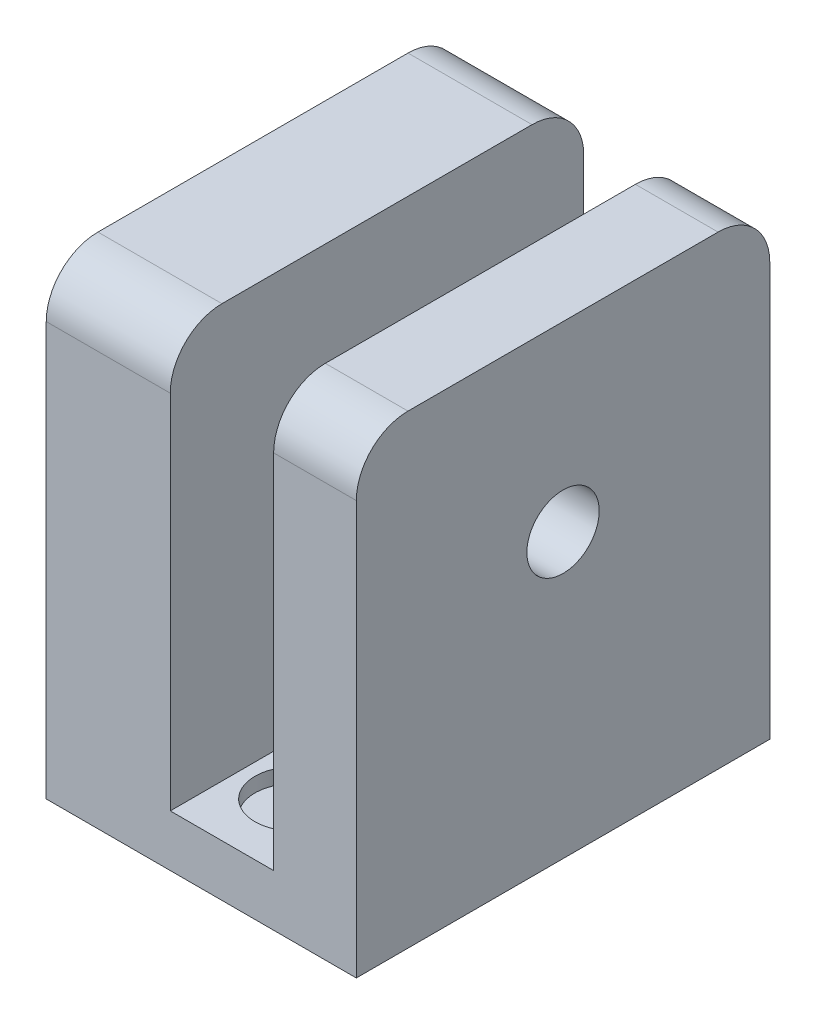
ISO-10303-21;
HEADER;
FILE_DESCRIPTION(('STEP AP214'),'2;1');
FILE_NAME('part.step','',(''),(''),'','','');
FILE_SCHEMA(('AUTOMOTIVE_DESIGN { 1 0 10303 214 1 1 1 1 }'));
ENDSEC;
DATA;
#1=APPLICATION_CONTEXT('core data for automotive mechanical design processes');
#2=APPLICATION_PROTOCOL_DEFINITION('international standard','automotive_design',2000,#1);
#3=PRODUCT_CONTEXT('',#1,'mechanical');
#4=PRODUCT('Part','Part','',(#3));
#5=PRODUCT_RELATED_PRODUCT_CATEGORY('part','',(#4));
#6=PRODUCT_DEFINITION_FORMATION('','',#4);
#7=PRODUCT_DEFINITION_CONTEXT('part definition',#1,'design');
#8=PRODUCT_DEFINITION('design','',#6,#7);
#9=PRODUCT_DEFINITION_SHAPE('','',#8);
#10=(LENGTH_UNIT() NAMED_UNIT(*) SI_UNIT(.MILLI.,.METRE.));
#11=(NAMED_UNIT(*) PLANE_ANGLE_UNIT() SI_UNIT($,.RADIAN.));
#12=(NAMED_UNIT(*) SI_UNIT($,.STERADIAN.) SOLID_ANGLE_UNIT());
#13=UNCERTAINTY_MEASURE_WITH_UNIT(LENGTH_MEASURE(1.E-05),#10,'distance_accuracy_value','');
#14=(GEOMETRIC_REPRESENTATION_CONTEXT(3) GLOBAL_UNCERTAINTY_ASSIGNED_CONTEXT((#13)) GLOBAL_UNIT_ASSIGNED_CONTEXT((#10,
#11,#12)) REPRESENTATION_CONTEXT('',''));
#15=CARTESIAN_POINT('',(0.,0.,0.));
#16=DIRECTION('',(0.,0.,1.));
#17=DIRECTION('',(1.,0.,0.));
#18=AXIS2_PLACEMENT_3D('',#15,#16,#17);
#19=CARTESIAN_POINT('',(-15.,45.,20.));
#20=DIRECTION('',(0.,0.,-1.));
#21=DIRECTION('',(-1.,0.,0.));
#22=AXIS2_PLACEMENT_3D('',#19,#20,#21);
#23=PLANE('',#22);
#24=DIRECTION('',(-1.,0.,0.));
#25=VECTOR('',#24,1.);
#26=CARTESIAN_POINT('',(15.,40.,20.));
#27=LINE('',#26,#25);
#28=CARTESIAN_POINT('',(-3.,40.,20.));
#29=VERTEX_POINT('',#28);
#30=CARTESIAN_POINT('',(-15.,40.,20.));
#31=VERTEX_POINT('',#30);
#32=EDGE_CURVE('E48',#29,#31,#27,.T.);
#33=ORIENTED_EDGE('',*,*,#32,.T.);
#34=DIRECTION('',(0.,-1.,0.));
#35=VECTOR('',#34,1.);
#36=CARTESIAN_POINT('',(-15.,45.,20.));
#37=LINE('',#36,#35);
#38=CARTESIAN_POINT('',(-15.,0.,20.));
#39=VERTEX_POINT('',#38);
#40=EDGE_CURVE('E141',#31,#39,#37,.T.);
#41=ORIENTED_EDGE('',*,*,#40,.T.);
#42=DIRECTION('',(1.,0.,0.));
#43=VECTOR('',#42,1.);
#44=CARTESIAN_POINT('',(-15.,0.,20.));
#45=LINE('',#44,#43);
#46=CARTESIAN_POINT('',(15.,0.,20.));
#47=VERTEX_POINT('',#46);
#48=EDGE_CURVE('E139',#39,#47,#45,.T.);
#49=ORIENTED_EDGE('',*,*,#48,.T.);
#50=DIRECTION('',(0.,-1.,0.));
#51=VECTOR('',#50,1.);
#52=CARTESIAN_POINT('',(15.,45.,20.));
#53=LINE('',#52,#51);
#54=CARTESIAN_POINT('',(15.,40.,20.));
#55=VERTEX_POINT('',#54);
#56=EDGE_CURVE('E132',#55,#47,#53,.T.);
#57=ORIENTED_EDGE('',*,*,#56,.F.);
#58=CARTESIAN_POINT('',(7.,40.,20.));
#59=VERTEX_POINT('',#58);
#60=EDGE_CURVE('E119',#55,#59,#27,.T.);
#61=ORIENTED_EDGE('',*,*,#60,.T.);
#62=DIRECTION('',(0.,1.,0.));
#63=VECTOR('',#62,1.);
#64=CARTESIAN_POINT('',(7.,45.,20.));
#65=LINE('',#64,#63);
#66=CARTESIAN_POINT('',(7.,5.,20.));
#67=VERTEX_POINT('',#66);
#68=EDGE_CURVE('E193',#67,#59,#65,.T.);
#69=ORIENTED_EDGE('',*,*,#68,.F.);
#70=DIRECTION('',(1.,0.,0.));
#71=VECTOR('',#70,1.);
#72=CARTESIAN_POINT('',(-3.,5.,20.));
#73=LINE('',#72,#71);
#74=CARTESIAN_POINT('',(-3.,5.,20.));
#75=VERTEX_POINT('',#74);
#76=EDGE_CURVE('E190',#75,#67,#73,.T.);
#77=ORIENTED_EDGE('',*,*,#76,.F.);
#78=DIRECTION('',(0.,-1.,0.));
#79=VECTOR('',#78,1.);
#80=CARTESIAN_POINT('',(-3.,45.,20.));
#81=LINE('',#80,#79);
#82=EDGE_CURVE('E188',#29,#75,#81,.T.);
#83=ORIENTED_EDGE('',*,*,#82,.F.);
#84=EDGE_LOOP('',(#33,#41,#49,#57,#61,#69,#77,#83));
#85=FACE_BOUND('',#84,.T.);
#86=ADVANCED_FACE('F33',(#85),#23,.F.);
#87=CARTESIAN_POINT('',(0.,45.,0.));
#88=DIRECTION('',(0.,-1.,0.));
#89=DIRECTION('',(0.,0.,-1.));
#90=AXIS2_PLACEMENT_3D('',#87,#88,#89);
#91=PLANE('',#90);
#92=DIRECTION('',(0.,0.,1.));
#93=VECTOR('',#92,1.);
#94=CARTESIAN_POINT('',(-15.,45.,20.));
#95=LINE('',#94,#93);
#96=CARTESIAN_POINT('',(-15.,45.,-15.));
#97=VERTEX_POINT('',#96);
#98=CARTESIAN_POINT('',(-15.,45.,15.));
#99=VERTEX_POINT('',#98);
#100=EDGE_CURVE('E142',#97,#99,#95,.T.);
#101=ORIENTED_EDGE('',*,*,#100,.T.);
#102=DIRECTION('',(-1.,0.,0.));
#103=VECTOR('',#102,1.);
#104=CARTESIAN_POINT('',(15.,45.,15.));
#105=LINE('',#104,#103);
#106=CARTESIAN_POINT('',(-3.,45.,15.));
#107=VERTEX_POINT('',#106);
#108=EDGE_CURVE('E127',#107,#99,#105,.T.);
#109=ORIENTED_EDGE('',*,*,#108,.F.);
#110=DIRECTION('',(0.,0.,1.));
#111=VECTOR('',#110,1.);
#112=CARTESIAN_POINT('',(-3.,45.,-20.));
#113=LINE('',#112,#111);
#114=CARTESIAN_POINT('',(-3.,45.,-15.));
#115=VERTEX_POINT('',#114);
#116=EDGE_CURVE('E195',#115,#107,#113,.T.);
#117=ORIENTED_EDGE('',*,*,#116,.F.);
#118=DIRECTION('',(-1.,0.,0.));
#119=VECTOR('',#118,1.);
#120=CARTESIAN_POINT('',(15.,45.,-15.));
#121=LINE('',#120,#119);
#122=EDGE_CURVE('E238',#115,#97,#121,.T.);
#123=ORIENTED_EDGE('',*,*,#122,.T.);
#124=EDGE_LOOP('',(#101,#109,#117,#123));
#125=FACE_BOUND('',#124,.T.);
#126=ADVANCED_FACE('F298',(#125),#91,.F.);
#127=DIRECTION('',(0.,0.,1.));
#128=VECTOR('',#127,1.);
#129=CARTESIAN_POINT('',(7.,45.,-20.));
#130=LINE('',#129,#128);
#131=CARTESIAN_POINT('',(7.,45.,-15.));
#132=VERTEX_POINT('',#131);
#133=CARTESIAN_POINT('',(7.,45.,15.));
#134=VERTEX_POINT('',#133);
#135=EDGE_CURVE('E167',#132,#134,#130,.T.);
#136=ORIENTED_EDGE('',*,*,#135,.T.);
#137=CARTESIAN_POINT('',(15.,45.,15.));
#138=VERTEX_POINT('',#137);
#139=EDGE_CURVE('E56',#138,#134,#105,.T.);
#140=ORIENTED_EDGE('',*,*,#139,.F.);
#141=DIRECTION('',(0.,0.,-1.));
#142=VECTOR('',#141,1.);
#143=CARTESIAN_POINT('',(15.,45.,20.));
#144=LINE('',#143,#142);
#145=CARTESIAN_POINT('',(15.,45.,-15.));
#146=VERTEX_POINT('',#145);
#147=EDGE_CURVE('E135',#138,#146,#144,.T.);
#148=ORIENTED_EDGE('',*,*,#147,.T.);
#149=EDGE_CURVE('E222',#146,#132,#121,.T.);
#150=ORIENTED_EDGE('',*,*,#149,.T.);
#151=EDGE_LOOP('',(#136,#140,#148,#150));
#152=FACE_BOUND('',#151,.T.);
#153=ADVANCED_FACE('F284',(#152),#91,.F.);
#154=CARTESIAN_POINT('',(15.,45.,20.));
#155=DIRECTION('',(-1.,0.,0.));
#156=DIRECTION('',(0.,0.,1.));
#157=AXIS2_PLACEMENT_3D('',#154,#155,#156);
#158=PLANE('',#157);
#159=CARTESIAN_POINT('',(15.,27.3918539452893,0.));
#160=DIRECTION('',(-1.,0.,0.));
#161=DIRECTION('',(0.,0.,1.));
#162=AXIS2_PLACEMENT_3D('',#159,#160,#161);
#163=CIRCLE('',#162,3.5);
#164=CARTESIAN_POINT('',(15.,27.3918539452893,3.5));
#165=VERTEX_POINT('',#164);
#166=EDGE_CURVE('E157',#165,#165,#163,.T.);
#167=ORIENTED_EDGE('',*,*,#166,.T.);
#168=EDGE_LOOP('',(#167));
#169=FACE_BOUND('',#168,.T.);
#170=ORIENTED_EDGE('',*,*,#147,.F.);
#171=CARTESIAN_POINT('',(15.,40.,15.));
#172=DIRECTION('',(1.,0.,0.));
#173=DIRECTION('',(0.,0.,-1.));
#174=AXIS2_PLACEMENT_3D('',#171,#172,#173);
#175=CIRCLE('',#174,5.);
#176=EDGE_CURVE('E122',#138,#55,#175,.T.);
#177=ORIENTED_EDGE('',*,*,#176,.T.);
#178=ORIENTED_EDGE('',*,*,#56,.T.);
#179=DIRECTION('',(0.,0.,-1.));
#180=VECTOR('',#179,1.);
#181=CARTESIAN_POINT('',(15.,0.,20.));
#182=LINE('',#181,#180);
#183=CARTESIAN_POINT('',(15.,0.,-20.));
#184=VERTEX_POINT('',#183);
#185=EDGE_CURVE('E198',#47,#184,#182,.T.);
#186=ORIENTED_EDGE('',*,*,#185,.T.);
#187=DIRECTION('',(0.,-1.,0.));
#188=VECTOR('',#187,1.);
#189=CARTESIAN_POINT('',(15.,45.,-20.));
#190=LINE('',#189,#188);
#191=CARTESIAN_POINT('',(15.,40.,-20.));
#192=VERTEX_POINT('',#191);
#193=EDGE_CURVE('E152',#192,#184,#190,.T.);
#194=ORIENTED_EDGE('',*,*,#193,.F.);
#195=CARTESIAN_POINT('',(15.,40.,-15.));
#196=DIRECTION('',(1.,0.,0.));
#197=DIRECTION('',(0.,0.,-1.));
#198=AXIS2_PLACEMENT_3D('',#195,#196,#197);
#199=CIRCLE('',#198,5.);
#200=EDGE_CURVE('E216',#192,#146,#199,.T.);
#201=ORIENTED_EDGE('',*,*,#200,.T.);
#202=EDGE_LOOP('',(#170,#177,#178,#186,#194,#201));
#203=FACE_BOUND('',#202,.T.);
#204=ADVANCED_FACE('F35',(#169,#203),#158,.F.);
#205=CARTESIAN_POINT('',(-15.,45.,-20.));
#206=DIRECTION('',(0.,0.,1.));
#207=DIRECTION('',(1.,0.,0.));
#208=AXIS2_PLACEMENT_3D('',#205,#206,#207);
#209=PLANE('',#208);
#210=DIRECTION('',(0.,-1.,0.));
#211=VECTOR('',#210,1.);
#212=CARTESIAN_POINT('',(-15.,45.,-20.));
#213=LINE('',#212,#211);
#214=CARTESIAN_POINT('',(-15.,40.,-20.));
#215=VERTEX_POINT('',#214);
#216=CARTESIAN_POINT('',(-15.,0.,-20.));
#217=VERTEX_POINT('',#216);
#218=EDGE_CURVE('E144',#215,#217,#213,.T.);
#219=ORIENTED_EDGE('',*,*,#218,.F.);
#220=DIRECTION('',(-1.,0.,0.));
#221=VECTOR('',#220,1.);
#222=CARTESIAN_POINT('',(15.,40.,-20.));
#223=LINE('',#222,#221);
#224=CARTESIAN_POINT('',(-3.,40.,-20.));
#225=VERTEX_POINT('',#224);
#226=EDGE_CURVE('E218',#225,#215,#223,.T.);
#227=ORIENTED_EDGE('',*,*,#226,.F.);
#228=DIRECTION('',(0.,-1.,0.));
#229=VECTOR('',#228,1.);
#230=CARTESIAN_POINT('',(-3.,45.,-20.));
#231=LINE('',#230,#229);
#232=CARTESIAN_POINT('',(-3.,5.,-20.));
#233=VERTEX_POINT('',#232);
#234=EDGE_CURVE('E184',#225,#233,#231,.T.);
#235=ORIENTED_EDGE('',*,*,#234,.T.);
#236=DIRECTION('',(1.,0.,0.));
#237=VECTOR('',#236,1.);
#238=CARTESIAN_POINT('',(-3.,5.,-20.));
#239=LINE('',#238,#237);
#240=CARTESIAN_POINT('',(7.,5.,-20.));
#241=VERTEX_POINT('',#240);
#242=EDGE_CURVE('E178',#233,#241,#239,.T.);
#243=ORIENTED_EDGE('',*,*,#242,.T.);
#244=DIRECTION('',(0.,1.,0.));
#245=VECTOR('',#244,1.);
#246=CARTESIAN_POINT('',(7.,45.,-20.));
#247=LINE('',#246,#245);
#248=CARTESIAN_POINT('',(7.,40.,-20.));
#249=VERTEX_POINT('',#248);
#250=EDGE_CURVE('E164',#241,#249,#247,.T.);
#251=ORIENTED_EDGE('',*,*,#250,.T.);
#252=EDGE_CURVE('E175',#192,#249,#223,.T.);
#253=ORIENTED_EDGE('',*,*,#252,.F.);
#254=ORIENTED_EDGE('',*,*,#193,.T.);
#255=DIRECTION('',(-1.,0.,0.));
#256=VECTOR('',#255,1.);
#257=CARTESIAN_POINT('',(-15.,0.,-20.));
#258=LINE('',#257,#256);
#259=EDGE_CURVE('E203',#184,#217,#258,.T.);
#260=ORIENTED_EDGE('',*,*,#259,.T.);
#261=EDGE_LOOP('',(#219,#227,#235,#243,#251,#253,#254,#260));
#262=FACE_BOUND('',#261,.T.);
#263=ADVANCED_FACE('F174',(#262),#209,.F.);
#264=CARTESIAN_POINT('',(-15.,45.,20.));
#265=DIRECTION('',(1.,0.,0.));
#266=DIRECTION('',(0.,0.,-1.));
#267=AXIS2_PLACEMENT_3D('',#264,#265,#266);
#268=PLANE('',#267);
#269=CARTESIAN_POINT('',(-15.,27.3918539452893,0.));
#270=DIRECTION('',(-1.,0.,0.));
#271=DIRECTION('',(0.,0.,1.));
#272=AXIS2_PLACEMENT_3D('',#269,#270,#271);
#273=CIRCLE('',#272,3.5);
#274=CARTESIAN_POINT('',(-15.,27.3918539452893,3.5));
#275=VERTEX_POINT('',#274);
#276=EDGE_CURVE('E232',#275,#275,#273,.T.);
#277=ORIENTED_EDGE('',*,*,#276,.F.);
#278=EDGE_LOOP('',(#277));
#279=FACE_BOUND('',#278,.T.);
#280=ORIENTED_EDGE('',*,*,#40,.F.);
#281=CARTESIAN_POINT('',(-15.,40.,15.));
#282=DIRECTION('',(1.,0.,0.));
#283=DIRECTION('',(0.,0.,-1.));
#284=AXIS2_PLACEMENT_3D('',#281,#282,#283);
#285=CIRCLE('',#284,5.);
#286=EDGE_CURVE('E136',#99,#31,#285,.T.);
#287=ORIENTED_EDGE('',*,*,#286,.F.);
#288=ORIENTED_EDGE('',*,*,#100,.F.);
#289=CARTESIAN_POINT('',(-15.,40.,-15.));
#290=DIRECTION('',(1.,0.,0.));
#291=DIRECTION('',(0.,0.,-1.));
#292=AXIS2_PLACEMENT_3D('',#289,#290,#291);
#293=CIRCLE('',#292,5.);
#294=EDGE_CURVE('E240',#215,#97,#293,.T.);
#295=ORIENTED_EDGE('',*,*,#294,.F.);
#296=ORIENTED_EDGE('',*,*,#218,.T.);
#297=DIRECTION('',(0.,0.,1.));
#298=VECTOR('',#297,1.);
#299=CARTESIAN_POINT('',(-15.,0.,20.));
#300=LINE('',#299,#298);
#301=EDGE_CURVE('E205',#217,#39,#300,.T.);
#302=ORIENTED_EDGE('',*,*,#301,.T.);
#303=EDGE_LOOP('',(#280,#287,#288,#295,#296,#302));
#304=FACE_BOUND('',#303,.T.);
#305=ADVANCED_FACE('F210',(#279,#304),#268,.F.);
#306=CARTESIAN_POINT('',(0.,0.,0.));
#307=DIRECTION('',(0.,-1.,0.));
#308=DIRECTION('',(0.,0.,-1.));
#309=AXIS2_PLACEMENT_3D('',#306,#307,#308);
#310=PLANE('',#309);
#311=CARTESIAN_POINT('',(2.,0.,13.));
#312=DIRECTION('',(0.,1.,0.));
#313=DIRECTION('',(0.,0.,1.));
#314=AXIS2_PLACEMENT_3D('',#311,#312,#313);
#315=CIRCLE('',#314,1.2);
#316=CARTESIAN_POINT('',(2.,0.,14.2));
#317=VERTEX_POINT('',#316);
#318=EDGE_CURVE('E259',#317,#317,#315,.T.);
#319=ORIENTED_EDGE('',*,*,#318,.T.);
#320=EDGE_LOOP('',(#319));
#321=FACE_BOUND('',#320,.T.);
#322=CARTESIAN_POINT('',(2.,0.,-13.));
#323=DIRECTION('',(0.,1.,0.));
#324=DIRECTION('',(0.,0.,1.));
#325=AXIS2_PLACEMENT_3D('',#322,#323,#324);
#326=CIRCLE('',#325,1.2);
#327=CARTESIAN_POINT('',(2.,0.,-11.8));
#328=VERTEX_POINT('',#327);
#329=EDGE_CURVE('E246',#328,#328,#326,.T.);
#330=ORIENTED_EDGE('',*,*,#329,.T.);
#331=EDGE_LOOP('',(#330));
#332=FACE_BOUND('',#331,.T.);
#333=ORIENTED_EDGE('',*,*,#185,.F.);
#334=ORIENTED_EDGE('',*,*,#48,.F.);
#335=ORIENTED_EDGE('',*,*,#301,.F.);
#336=ORIENTED_EDGE('',*,*,#259,.F.);
#337=EDGE_LOOP('',(#333,#334,#335,#336));
#338=FACE_BOUND('',#337,.T.);
#339=ADVANCED_FACE('F215',(#321,#332,#338),#310,.T.);
#340=CARTESIAN_POINT('',(-3.,45.,-20.));
#341=DIRECTION('',(-1.,0.,0.));
#342=DIRECTION('',(0.,-1.,0.));
#343=AXIS2_PLACEMENT_3D('',#340,#341,#342);
#344=PLANE('',#343);
#345=CARTESIAN_POINT('',(-3.,27.3918539452893,0.));
#346=DIRECTION('',(-1.,0.,0.));
#347=DIRECTION('',(0.,-1.,0.));
#348=AXIS2_PLACEMENT_3D('',#345,#346,#347);
#349=CIRCLE('',#348,3.5);
#350=CARTESIAN_POINT('',(-3.,23.8918539452893,0.));
#351=VERTEX_POINT('',#350);
#352=EDGE_CURVE('E156',#351,#351,#349,.T.);
#353=ORIENTED_EDGE('',*,*,#352,.T.);
#354=EDGE_LOOP('',(#353));
#355=FACE_BOUND('',#354,.T.);
#356=ORIENTED_EDGE('',*,*,#116,.T.);
#357=CARTESIAN_POINT('',(-3.,40.,15.));
#358=DIRECTION('',(-1.,0.,0.));
#359=DIRECTION('',(0.,-1.,0.));
#360=AXIS2_PLACEMENT_3D('',#357,#358,#359);
#361=CIRCLE('',#360,5.);
#362=EDGE_CURVE('E242',#107,#29,#361,.F.);
#363=ORIENTED_EDGE('',*,*,#362,.T.);
#364=ORIENTED_EDGE('',*,*,#82,.T.);
#365=DIRECTION('',(0.,0.,1.));
#366=VECTOR('',#365,1.);
#367=CARTESIAN_POINT('',(-3.,5.,-20.));
#368=LINE('',#367,#366);
#369=EDGE_CURVE('E179',#233,#75,#368,.T.);
#370=ORIENTED_EDGE('',*,*,#369,.F.);
#371=ORIENTED_EDGE('',*,*,#234,.F.);
#372=CARTESIAN_POINT('',(-3.,40.,-15.));
#373=DIRECTION('',(-1.,0.,0.));
#374=DIRECTION('',(0.,-1.,0.));
#375=AXIS2_PLACEMENT_3D('',#372,#373,#374);
#376=CIRCLE('',#375,5.);
#377=EDGE_CURVE('E227',#225,#115,#376,.F.);
#378=ORIENTED_EDGE('',*,*,#377,.T.);
#379=EDGE_LOOP('',(#356,#363,#364,#370,#371,#378));
#380=FACE_BOUND('',#379,.T.);
#381=ADVANCED_FACE('F226',(#355,#380),#344,.F.);
#382=CARTESIAN_POINT('',(7.,45.,-20.));
#383=DIRECTION('',(1.,0.,0.));
#384=DIRECTION('',(0.,1.,0.));
#385=AXIS2_PLACEMENT_3D('',#382,#383,#384);
#386=PLANE('',#385);
#387=CARTESIAN_POINT('',(7.,27.3918539452893,0.));
#388=DIRECTION('',(1.,0.,0.));
#389=DIRECTION('',(0.,1.,0.));
#390=AXIS2_PLACEMENT_3D('',#387,#388,#389);
#391=CIRCLE('',#390,3.5);
#392=CARTESIAN_POINT('',(7.,30.8918539452893,0.));
#393=VERTEX_POINT('',#392);
#394=EDGE_CURVE('E154',#393,#393,#391,.T.);
#395=ORIENTED_EDGE('',*,*,#394,.T.);
#396=EDGE_LOOP('',(#395));
#397=FACE_BOUND('',#396,.T.);
#398=ORIENTED_EDGE('',*,*,#68,.T.);
#399=CARTESIAN_POINT('',(7.,40.,15.));
#400=DIRECTION('',(1.,0.,0.));
#401=DIRECTION('',(0.,1.,0.));
#402=AXIS2_PLACEMENT_3D('',#399,#400,#401);
#403=CIRCLE('',#402,5.);
#404=EDGE_CURVE('E11',#59,#134,#403,.F.);
#405=ORIENTED_EDGE('',*,*,#404,.T.);
#406=ORIENTED_EDGE('',*,*,#135,.F.);
#407=CARTESIAN_POINT('',(7.,40.,-15.));
#408=DIRECTION('',(1.,0.,0.));
#409=DIRECTION('',(0.,1.,0.));
#410=AXIS2_PLACEMENT_3D('',#407,#408,#409);
#411=CIRCLE('',#410,5.);
#412=EDGE_CURVE('E41',#132,#249,#411,.F.);
#413=ORIENTED_EDGE('',*,*,#412,.T.);
#414=ORIENTED_EDGE('',*,*,#250,.F.);
#415=DIRECTION('',(0.,0.,1.));
#416=VECTOR('',#415,1.);
#417=CARTESIAN_POINT('',(7.,5.,-20.));
#418=LINE('',#417,#416);
#419=EDGE_CURVE('E182',#241,#67,#418,.T.);
#420=ORIENTED_EDGE('',*,*,#419,.T.);
#421=EDGE_LOOP('',(#398,#405,#406,#413,#414,#420));
#422=FACE_BOUND('',#421,.T.);
#423=ADVANCED_FACE('F163',(#397,#422),#386,.F.);
#424=CARTESIAN_POINT('',(-3.,5.,-20.));
#425=DIRECTION('',(0.,-1.,0.));
#426=DIRECTION('',(0.,0.,-1.));
#427=AXIS2_PLACEMENT_3D('',#424,#425,#426);
#428=PLANE('',#427);
#429=CARTESIAN_POINT('',(2.,5.,13.));
#430=DIRECTION('',(0.,1.,0.));
#431=DIRECTION('',(0.,0.,1.));
#432=AXIS2_PLACEMENT_3D('',#429,#430,#431);
#433=CIRCLE('',#432,3.8095);
#434=CARTESIAN_POINT('',(2.,5.,16.8095));
#435=VERTEX_POINT('',#434);
#436=EDGE_CURVE('E268',#435,#435,#433,.T.);
#437=ORIENTED_EDGE('',*,*,#436,.F.);
#438=EDGE_LOOP('',(#437));
#439=FACE_BOUND('',#438,.T.);
#440=CARTESIAN_POINT('',(2.,5.,-13.));
#441=DIRECTION('',(0.,1.,0.));
#442=DIRECTION('',(0.,0.,1.));
#443=AXIS2_PLACEMENT_3D('',#440,#441,#442);
#444=CIRCLE('',#443,3.8095);
#445=CARTESIAN_POINT('',(2.,5.,-9.1905));
#446=VERTEX_POINT('',#445);
#447=EDGE_CURVE('E256',#446,#446,#444,.T.);
#448=ORIENTED_EDGE('',*,*,#447,.F.);
#449=EDGE_LOOP('',(#448));
#450=FACE_BOUND('',#449,.T.);
#451=ORIENTED_EDGE('',*,*,#76,.T.);
#452=ORIENTED_EDGE('',*,*,#419,.F.);
#453=ORIENTED_EDGE('',*,*,#242,.F.);
#454=ORIENTED_EDGE('',*,*,#369,.T.);
#455=EDGE_LOOP('',(#451,#452,#453,#454));
#456=FACE_BOUND('',#455,.T.);
#457=ADVANCED_FACE('F274',(#439,#450,#456),#428,.F.);
#458=CARTESIAN_POINT('',(15.,27.3918539452893,0.));
#459=DIRECTION('',(-1.,0.,0.));
#460=DIRECTION('',(0.,0.,1.));
#461=AXIS2_PLACEMENT_3D('',#458,#459,#460);
#462=CYLINDRICAL_SURFACE('',#461,3.5);
#463=ORIENTED_EDGE('',*,*,#166,.F.);
#464=EDGE_LOOP('',(#463));
#465=FACE_BOUND('',#464,.T.);
#466=ORIENTED_EDGE('',*,*,#394,.F.);
#467=EDGE_LOOP('',(#466));
#468=FACE_BOUND('',#467,.T.);
#469=ADVANCED_FACE('F277',(#465,#468),#462,.F.);
#470=ORIENTED_EDGE('',*,*,#276,.T.);
#471=EDGE_LOOP('',(#470));
#472=FACE_BOUND('',#471,.T.);
#473=ORIENTED_EDGE('',*,*,#352,.F.);
#474=EDGE_LOOP('',(#473));
#475=FACE_BOUND('',#474,.T.);
#476=ADVANCED_FACE('F288',(#472,#475),#462,.F.);
#477=CARTESIAN_POINT('',(15.,40.,-15.));
#478=DIRECTION('',(-1.,0.,0.));
#479=DIRECTION('',(0.,0.,1.));
#480=AXIS2_PLACEMENT_3D('',#477,#478,#479);
#481=CYLINDRICAL_SURFACE('',#480,5.);
#482=ORIENTED_EDGE('',*,*,#149,.F.);
#483=ORIENTED_EDGE('',*,*,#200,.F.);
#484=ORIENTED_EDGE('',*,*,#252,.T.);
#485=ORIENTED_EDGE('',*,*,#412,.F.);
#486=EDGE_LOOP('',(#482,#483,#484,#485));
#487=FACE_BOUND('',#486,.T.);
#488=ADVANCED_FACE('F285',(#487),#481,.T.);
#489=ORIENTED_EDGE('',*,*,#226,.T.);
#490=ORIENTED_EDGE('',*,*,#294,.T.);
#491=ORIENTED_EDGE('',*,*,#122,.F.);
#492=ORIENTED_EDGE('',*,*,#377,.F.);
#493=EDGE_LOOP('',(#489,#490,#491,#492));
#494=FACE_BOUND('',#493,.T.);
#495=ADVANCED_FACE('F287',(#494),#481,.T.);
#496=CARTESIAN_POINT('',(15.,40.,15.));
#497=DIRECTION('',(-1.,0.,0.));
#498=DIRECTION('',(0.,0.,1.));
#499=AXIS2_PLACEMENT_3D('',#496,#497,#498);
#500=CYLINDRICAL_SURFACE('',#499,5.);
#501=ORIENTED_EDGE('',*,*,#60,.F.);
#502=ORIENTED_EDGE('',*,*,#176,.F.);
#503=ORIENTED_EDGE('',*,*,#139,.T.);
#504=ORIENTED_EDGE('',*,*,#404,.F.);
#505=EDGE_LOOP('',(#501,#502,#503,#504));
#506=FACE_BOUND('',#505,.T.);
#507=ADVANCED_FACE('F121',(#506),#500,.T.);
#508=ORIENTED_EDGE('',*,*,#108,.T.);
#509=ORIENTED_EDGE('',*,*,#286,.T.);
#510=ORIENTED_EDGE('',*,*,#32,.F.);
#511=ORIENTED_EDGE('',*,*,#362,.F.);
#512=EDGE_LOOP('',(#508,#509,#510,#511));
#513=FACE_BOUND('',#512,.T.);
#514=ADVANCED_FACE('F346',(#513),#500,.T.);
#515=CARTESIAN_POINT('',(2.,5.,-13.));
#516=DIRECTION('',(0.,1.,0.));
#517=DIRECTION('',(0.,0.,1.));
#518=AXIS2_PLACEMENT_3D('',#515,#516,#517);
#519=CYLINDRICAL_SURFACE('',#518,1.2);
#520=ORIENTED_EDGE('',*,*,#329,.F.);
#521=EDGE_LOOP('',(#520));
#522=FACE_BOUND('',#521,.T.);
#523=CARTESIAN_POINT('',(2.,3.6,-13.));
#524=DIRECTION('',(0.,1.,0.));
#525=DIRECTION('',(0.,0.,1.));
#526=AXIS2_PLACEMENT_3D('',#523,#524,#525);
#527=CIRCLE('',#526,1.2);
#528=CARTESIAN_POINT('',(2.,3.6,-11.8));
#529=VERTEX_POINT('',#528);
#530=EDGE_CURVE('E250',#529,#529,#527,.T.);
#531=ORIENTED_EDGE('',*,*,#530,.T.);
#532=EDGE_LOOP('',(#531));
#533=FACE_BOUND('',#532,.T.);
#534=ADVANCED_FACE('F342',(#522,#533),#519,.F.);
#535=CARTESIAN_POINT('',(3.2,3.6,-13.));
#536=DIRECTION('',(0.,-1.,0.));
#537=DIRECTION('',(0.,0.,-1.));
#538=AXIS2_PLACEMENT_3D('',#535,#536,#537);
#539=PLANE('',#538);
#540=ORIENTED_EDGE('',*,*,#530,.F.);
#541=EDGE_LOOP('',(#540));
#542=FACE_BOUND('',#541,.T.);
#543=CARTESIAN_POINT('',(2.,3.6,-13.));
#544=DIRECTION('',(0.,1.,0.));
#545=DIRECTION('',(0.,0.,1.));
#546=AXIS2_PLACEMENT_3D('',#543,#544,#545);
#547=CIRCLE('',#546,3.8095);
#548=CARTESIAN_POINT('',(2.,3.6,-9.1905));
#549=VERTEX_POINT('',#548);
#550=EDGE_CURVE('E253',#549,#549,#547,.T.);
#551=ORIENTED_EDGE('',*,*,#550,.T.);
#552=EDGE_LOOP('',(#551));
#553=FACE_BOUND('',#552,.T.);
#554=ADVANCED_FACE('F345',(#542,#553),#539,.F.);
#555=CARTESIAN_POINT('',(2.,5.,-13.));
#556=DIRECTION('',(0.,1.,0.));
#557=DIRECTION('',(0.,0.,1.));
#558=AXIS2_PLACEMENT_3D('',#555,#556,#557);
#559=CYLINDRICAL_SURFACE('',#558,3.8095);
#560=ORIENTED_EDGE('',*,*,#550,.F.);
#561=EDGE_LOOP('',(#560));
#562=FACE_BOUND('',#561,.T.);
#563=ORIENTED_EDGE('',*,*,#447,.T.);
#564=EDGE_LOOP('',(#563));
#565=FACE_BOUND('',#564,.T.);
#566=ADVANCED_FACE('F352',(#562,#565),#559,.F.);
#567=CARTESIAN_POINT('',(2.,5.,13.));
#568=DIRECTION('',(0.,1.,0.));
#569=DIRECTION('',(0.,0.,1.));
#570=AXIS2_PLACEMENT_3D('',#567,#568,#569);
#571=CYLINDRICAL_SURFACE('',#570,1.2);
#572=ORIENTED_EDGE('',*,*,#318,.F.);
#573=EDGE_LOOP('',(#572));
#574=FACE_BOUND('',#573,.T.);
#575=CARTESIAN_POINT('',(2.,3.6,13.));
#576=DIRECTION('',(0.,1.,0.));
#577=DIRECTION('',(0.,0.,1.));
#578=AXIS2_PLACEMENT_3D('',#575,#576,#577);
#579=CIRCLE('',#578,1.2);
#580=CARTESIAN_POINT('',(2.,3.6,14.2));
#581=VERTEX_POINT('',#580);
#582=EDGE_CURVE('E262',#581,#581,#579,.T.);
#583=ORIENTED_EDGE('',*,*,#582,.T.);
#584=EDGE_LOOP('',(#583));
#585=FACE_BOUND('',#584,.T.);
#586=ADVANCED_FACE('F358',(#574,#585),#571,.F.);
#587=CARTESIAN_POINT('',(3.2,3.6,13.));
#588=DIRECTION('',(0.,-1.,0.));
#589=DIRECTION('',(0.,0.,-1.));
#590=AXIS2_PLACEMENT_3D('',#587,#588,#589);
#591=PLANE('',#590);
#592=ORIENTED_EDGE('',*,*,#582,.F.);
#593=EDGE_LOOP('',(#592));
#594=FACE_BOUND('',#593,.T.);
#595=CARTESIAN_POINT('',(2.,3.6,13.));
#596=DIRECTION('',(0.,1.,0.));
#597=DIRECTION('',(0.,0.,1.));
#598=AXIS2_PLACEMENT_3D('',#595,#596,#597);
#599=CIRCLE('',#598,3.8095);
#600=CARTESIAN_POINT('',(2.,3.6,16.8095));
#601=VERTEX_POINT('',#600);
#602=EDGE_CURVE('E265',#601,#601,#599,.T.);
#603=ORIENTED_EDGE('',*,*,#602,.T.);
#604=EDGE_LOOP('',(#603));
#605=FACE_BOUND('',#604,.T.);
#606=ADVANCED_FACE('F363',(#594,#605),#591,.F.);
#607=CARTESIAN_POINT('',(2.,5.,13.));
#608=DIRECTION('',(0.,1.,0.));
#609=DIRECTION('',(0.,0.,1.));
#610=AXIS2_PLACEMENT_3D('',#607,#608,#609);
#611=CYLINDRICAL_SURFACE('',#610,3.8095);
#612=ORIENTED_EDGE('',*,*,#602,.F.);
#613=EDGE_LOOP('',(#612));
#614=FACE_BOUND('',#613,.T.);
#615=ORIENTED_EDGE('',*,*,#436,.T.);
#616=EDGE_LOOP('',(#615));
#617=FACE_BOUND('',#616,.T.);
#618=ADVANCED_FACE('F272',(#614,#617),#611,.F.);
#619=CLOSED_SHELL('',(#86,#126,#153,#204,#263,#305,#339,#381,#423,#457,#469,#476,#488,#495,#507,
#514,#534,#554,#566,#586,#606,#618));
#620=MANIFOLD_SOLID_BREP('B2',#619);
#621=ADVANCED_BREP_SHAPE_REPRESENTATION('',(#18,#620),#14);
#622=SHAPE_DEFINITION_REPRESENTATION(#9,#621);
ENDSEC;
END-ISO-10303-21;
